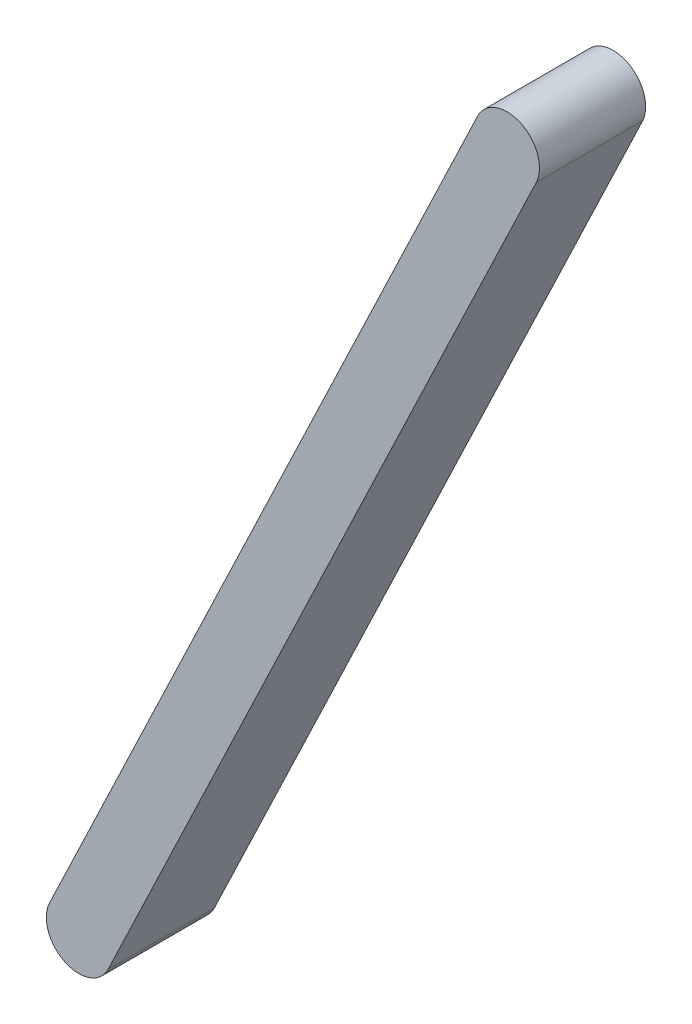
ISO-10303-21;
HEADER;
FILE_DESCRIPTION(('STEP AP214'),'2;1');
FILE_NAME('part.step','',(''),(''),'','','');
FILE_SCHEMA(('AUTOMOTIVE_DESIGN { 1 0 10303 214 1 1 1 1 }'));
ENDSEC;
DATA;
#1=APPLICATION_CONTEXT('core data for automotive mechanical design processes');
#2=APPLICATION_PROTOCOL_DEFINITION('international standard','automotive_design',2000,#1);
#3=PRODUCT_CONTEXT('',#1,'mechanical');
#4=PRODUCT('Part','Part','',(#3));
#5=PRODUCT_RELATED_PRODUCT_CATEGORY('part','',(#4));
#6=PRODUCT_DEFINITION_FORMATION('','',#4);
#7=PRODUCT_DEFINITION_CONTEXT('part definition',#1,'design');
#8=PRODUCT_DEFINITION('design','',#6,#7);
#9=PRODUCT_DEFINITION_SHAPE('','',#8);
#10=(LENGTH_UNIT() NAMED_UNIT(*) SI_UNIT(.MILLI.,.METRE.));
#11=(NAMED_UNIT(*) PLANE_ANGLE_UNIT() SI_UNIT($,.RADIAN.));
#12=(NAMED_UNIT(*) SI_UNIT($,.STERADIAN.) SOLID_ANGLE_UNIT());
#13=UNCERTAINTY_MEASURE_WITH_UNIT(LENGTH_MEASURE(1.E-05),#10,'distance_accuracy_value','');
#14=(GEOMETRIC_REPRESENTATION_CONTEXT(3) GLOBAL_UNCERTAINTY_ASSIGNED_CONTEXT((#13)) GLOBAL_UNIT_ASSIGNED_CONTEXT((#10,
#11,#12)) REPRESENTATION_CONTEXT('',''));
#15=CARTESIAN_POINT('',(0.,0.,0.));
#16=DIRECTION('',(0.,0.,1.));
#17=DIRECTION('',(1.,0.,0.));
#18=AXIS2_PLACEMENT_3D('',#15,#16,#17);
#19=CARTESIAN_POINT('',(170.821054898306,-70.0140274636036,2.));
#20=DIRECTION('',(0.,0.,-1.));
#21=DIRECTION('',(-1.,0.,0.));
#22=AXIS2_PLACEMENT_3D('',#19,#20,#21);
#23=CYLINDRICAL_SURFACE('',#22,0.612691769631059);
#24=CARTESIAN_POINT('',(170.821054898306,-70.0140274636036,0.));
#25=DIRECTION('',(0.,0.,1.));
#26=DIRECTION('',(1.,0.,0.));
#27=AXIS2_PLACEMENT_3D('',#24,#25,#26);
#28=CIRCLE('',#27,0.612691769631059);
#29=CARTESIAN_POINT('',(170.268287260263,-69.7497564986717,0.));
#30=VERTEX_POINT('',#29);
#31=CARTESIAN_POINT('',(171.373822536349,-70.2782984285354,0.));
#32=VERTEX_POINT('',#31);
#33=EDGE_CURVE('E98',#30,#32,#28,.T.);
#34=ORIENTED_EDGE('',*,*,#33,.T.);
#35=DIRECTION('',(0.,0.,-1.));
#36=VECTOR('',#35,1.);
#37=CARTESIAN_POINT('',(171.373822536349,-70.2782984285354,2.));
#38=LINE('',#37,#36);
#39=CARTESIAN_POINT('',(171.373822536349,-70.2782984285354,2.));
#40=VERTEX_POINT('',#39);
#41=EDGE_CURVE('E11',#40,#32,#38,.T.);
#42=ORIENTED_EDGE('',*,*,#41,.F.);
#43=CARTESIAN_POINT('',(170.821054898306,-70.0140274636036,2.));
#44=DIRECTION('',(0.,0.,1.));
#45=DIRECTION('',(1.,0.,0.));
#46=AXIS2_PLACEMENT_3D('',#43,#44,#45);
#47=CIRCLE('',#46,0.612691769631059);
#48=CARTESIAN_POINT('',(170.268287260263,-69.7497564986717,2.));
#49=VERTEX_POINT('',#48);
#50=EDGE_CURVE('E86',#49,#40,#47,.T.);
#51=ORIENTED_EDGE('',*,*,#50,.F.);
#52=DIRECTION('',(0.,0.,-1.));
#53=VECTOR('',#52,1.);
#54=CARTESIAN_POINT('',(170.268287260263,-69.7497564986717,2.));
#55=LINE('',#54,#53);
#56=EDGE_CURVE('E94',#49,#30,#55,.T.);
#57=ORIENTED_EDGE('',*,*,#56,.T.);
#58=EDGE_LOOP('',(#34,#42,#51,#57));
#59=FACE_BOUND('',#58,.T.);
#60=ADVANCED_FACE('F35',(#59),#23,.T.);
#61=CARTESIAN_POINT('',(171.373822536349,-70.2782984285354,2.));
#62=DIRECTION('',(-0.902195305113774,0.431327754069529,0.));
#63=DIRECTION('',(-0.431327754069529,-0.902195305113774,0.));
#64=AXIS2_PLACEMENT_3D('',#61,#62,#63);
#65=PLANE('',#64);
#66=DIRECTION('',(0.431327754069529,0.902195305113774,0.));
#67=VECTOR('',#66,1.);
#68=CARTESIAN_POINT('',(171.373822536349,-70.2782984285354,0.));
#69=LINE('',#68,#67);
#70=CARTESIAN_POINT('',(179.435903066646,-53.4150867866745,0.));
#71=VERTEX_POINT('',#70);
#72=EDGE_CURVE('E90',#32,#71,#69,.T.);
#73=ORIENTED_EDGE('',*,*,#72,.T.);
#74=DIRECTION('',(0.,0.,-1.));
#75=VECTOR('',#74,1.);
#76=CARTESIAN_POINT('',(179.435903066646,-53.4150867866745,2.));
#77=LINE('',#76,#75);
#78=CARTESIAN_POINT('',(179.435903066646,-53.4150867866745,2.));
#79=VERTEX_POINT('',#78);
#80=EDGE_CURVE('E43',#79,#71,#77,.T.);
#81=ORIENTED_EDGE('',*,*,#80,.F.);
#82=DIRECTION('',(0.431327754069529,0.902195305113774,0.));
#83=VECTOR('',#82,1.);
#84=CARTESIAN_POINT('',(171.373822536349,-70.2782984285354,2.));
#85=LINE('',#84,#83);
#86=EDGE_CURVE('E81',#40,#79,#85,.T.);
#87=ORIENTED_EDGE('',*,*,#86,.F.);
#88=ORIENTED_EDGE('',*,*,#41,.T.);
#89=EDGE_LOOP('',(#73,#81,#87,#88));
#90=FACE_BOUND('',#89,.T.);
#91=ADVANCED_FACE('F89',(#90),#65,.F.);
#92=CARTESIAN_POINT('',(178.883135428603,-53.1508158217426,2.));
#93=DIRECTION('',(0.,0.,-1.));
#94=DIRECTION('',(-1.,0.,0.));
#95=AXIS2_PLACEMENT_3D('',#92,#93,#94);
#96=CYLINDRICAL_SURFACE('',#95,0.612691769631055);
#97=CARTESIAN_POINT('',(178.883135428603,-53.1508158217426,0.));
#98=DIRECTION('',(0.,0.,1.));
#99=DIRECTION('',(1.,0.,0.));
#100=AXIS2_PLACEMENT_3D('',#97,#98,#99);
#101=CIRCLE('',#100,0.612691769631055);
#102=CARTESIAN_POINT('',(178.33036779056,-52.8865448568108,0.));
#103=VERTEX_POINT('',#102);
#104=EDGE_CURVE('E68',#71,#103,#101,.T.);
#105=ORIENTED_EDGE('',*,*,#104,.T.);
#106=DIRECTION('',(0.,0.,-1.));
#107=VECTOR('',#106,1.);
#108=CARTESIAN_POINT('',(178.33036779056,-52.8865448568108,2.));
#109=LINE('',#108,#107);
#110=CARTESIAN_POINT('',(178.33036779056,-52.8865448568108,2.));
#111=VERTEX_POINT('',#110);
#112=EDGE_CURVE('E91',#111,#103,#109,.T.);
#113=ORIENTED_EDGE('',*,*,#112,.F.);
#114=CARTESIAN_POINT('',(178.883135428603,-53.1508158217426,2.));
#115=DIRECTION('',(0.,0.,1.));
#116=DIRECTION('',(1.,0.,0.));
#117=AXIS2_PLACEMENT_3D('',#114,#115,#116);
#118=CIRCLE('',#117,0.612691769631055);
#119=EDGE_CURVE('E84',#79,#111,#118,.T.);
#120=ORIENTED_EDGE('',*,*,#119,.F.);
#121=ORIENTED_EDGE('',*,*,#80,.T.);
#122=EDGE_LOOP('',(#105,#113,#120,#121));
#123=FACE_BOUND('',#122,.T.);
#124=ADVANCED_FACE('F92',(#123),#96,.T.);
#125=CARTESIAN_POINT('',(170.268287260263,-69.7497564986717,2.));
#126=DIRECTION('',(0.902195305113774,-0.431327754069529,0.));
#127=DIRECTION('',(0.431327754069529,0.902195305113774,0.));
#128=AXIS2_PLACEMENT_3D('',#125,#126,#127);
#129=PLANE('',#128);
#130=DIRECTION('',(-0.431327754069529,-0.902195305113774,0.));
#131=VECTOR('',#130,1.);
#132=CARTESIAN_POINT('',(170.268287260263,-69.7497564986717,0.));
#133=LINE('',#132,#131);
#134=EDGE_CURVE('E74',#103,#30,#133,.T.);
#135=ORIENTED_EDGE('',*,*,#134,.T.);
#136=ORIENTED_EDGE('',*,*,#56,.F.);
#137=DIRECTION('',(-0.431327754069529,-0.902195305113774,0.));
#138=VECTOR('',#137,1.);
#139=CARTESIAN_POINT('',(170.268287260263,-69.7497564986717,2.));
#140=LINE('',#139,#138);
#141=EDGE_CURVE('E51',#111,#49,#140,.T.);
#142=ORIENTED_EDGE('',*,*,#141,.F.);
#143=ORIENTED_EDGE('',*,*,#112,.T.);
#144=EDGE_LOOP('',(#135,#136,#142,#143));
#145=FACE_BOUND('',#144,.T.);
#146=ADVANCED_FACE('F105',(#145),#129,.F.);
#147=CARTESIAN_POINT('',(170.821054898306,-70.0140274636036,2.));
#148=DIRECTION('',(0.,0.,1.));
#149=DIRECTION('',(1.,0.,0.));
#150=AXIS2_PLACEMENT_3D('',#147,#148,#149);
#151=PLANE('',#150);
#152=ORIENTED_EDGE('',*,*,#50,.T.);
#153=ORIENTED_EDGE('',*,*,#86,.T.);
#154=ORIENTED_EDGE('',*,*,#119,.T.);
#155=ORIENTED_EDGE('',*,*,#141,.T.);
#156=EDGE_LOOP('',(#152,#153,#154,#155));
#157=FACE_BOUND('',#156,.T.);
#158=ADVANCED_FACE('F82',(#157),#151,.T.);
#159=CARTESIAN_POINT('',(170.821054898306,-70.0140274636036,0.));
#160=DIRECTION('',(0.,0.,1.));
#161=DIRECTION('',(1.,0.,0.));
#162=AXIS2_PLACEMENT_3D('',#159,#160,#161);
#163=PLANE('',#162);
#164=ORIENTED_EDGE('',*,*,#33,.F.);
#165=ORIENTED_EDGE('',*,*,#134,.F.);
#166=ORIENTED_EDGE('',*,*,#104,.F.);
#167=ORIENTED_EDGE('',*,*,#72,.F.);
#168=EDGE_LOOP('',(#164,#165,#166,#167));
#169=FACE_BOUND('',#168,.T.);
#170=ADVANCED_FACE('F108',(#169),#163,.F.);
#171=CLOSED_SHELL('',(#60,#91,#124,#146,#158,#170));
#172=MANIFOLD_SOLID_BREP('B2',#171);
#173=ADVANCED_BREP_SHAPE_REPRESENTATION('',(#18,#172),#14);
#174=SHAPE_DEFINITION_REPRESENTATION(#9,#173);
ENDSEC;
END-ISO-10303-21;
